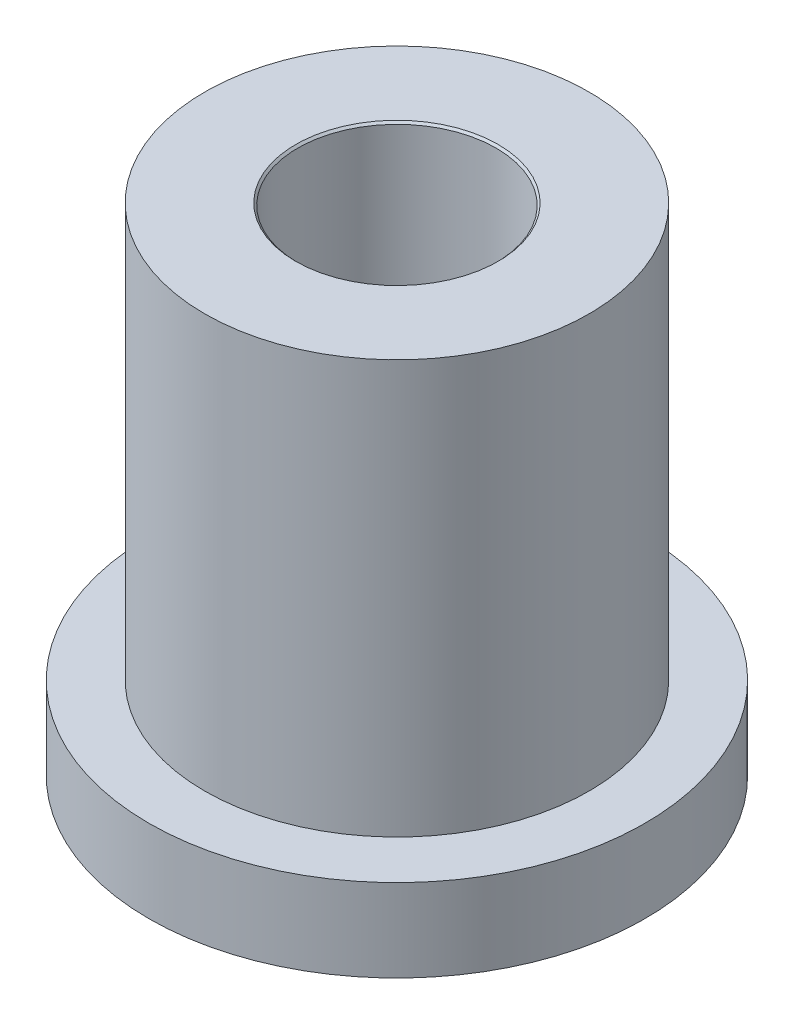
ISO-10303-21;
HEADER;
FILE_DESCRIPTION(('STEP AP214'),'2;1');
FILE_NAME('part.step','',(''),(''),'','','');
FILE_SCHEMA(('AUTOMOTIVE_DESIGN { 1 0 10303 214 1 1 1 1 }'));
ENDSEC;
DATA;
#1=APPLICATION_CONTEXT('core data for automotive mechanical design processes');
#2=APPLICATION_PROTOCOL_DEFINITION('international standard','automotive_design',2000,#1);
#3=PRODUCT_CONTEXT('',#1,'mechanical');
#4=PRODUCT('Part','Part','',(#3));
#5=PRODUCT_RELATED_PRODUCT_CATEGORY('part','',(#4));
#6=PRODUCT_DEFINITION_FORMATION('','',#4);
#7=PRODUCT_DEFINITION_CONTEXT('part definition',#1,'design');
#8=PRODUCT_DEFINITION('design','',#6,#7);
#9=PRODUCT_DEFINITION_SHAPE('','',#8);
#10=(LENGTH_UNIT() NAMED_UNIT(*) SI_UNIT(.MILLI.,.METRE.));
#11=(NAMED_UNIT(*) PLANE_ANGLE_UNIT() SI_UNIT($,.RADIAN.));
#12=(NAMED_UNIT(*) SI_UNIT($,.STERADIAN.) SOLID_ANGLE_UNIT());
#13=UNCERTAINTY_MEASURE_WITH_UNIT(LENGTH_MEASURE(1.E-05),#10,'distance_accuracy_value','');
#14=(GEOMETRIC_REPRESENTATION_CONTEXT(3) GLOBAL_UNCERTAINTY_ASSIGNED_CONTEXT((#13)) GLOBAL_UNIT_ASSIGNED_CONTEXT((#10,
#11,#12)) REPRESENTATION_CONTEXT('',''));
#15=CARTESIAN_POINT('',(0.,0.,0.));
#16=DIRECTION('',(0.,0.,1.));
#17=DIRECTION('',(1.,0.,0.));
#18=AXIS2_PLACEMENT_3D('',#15,#16,#17);
#19=CARTESIAN_POINT('',(0.,1.,0.));
#20=DIRECTION('',(0.,-1.,0.));
#21=DIRECTION('',(0.,0.,-1.));
#22=AXIS2_PLACEMENT_3D('',#19,#20,#21);
#23=CYLINDRICAL_SURFACE('',#22,3.);
#24=CARTESIAN_POINT('',(0.,1.,0.));
#25=DIRECTION('',(0.,1.,0.));
#26=DIRECTION('',(0.,0.,1.));
#27=AXIS2_PLACEMENT_3D('',#24,#25,#26);
#28=CIRCLE('',#27,3.);
#29=CARTESIAN_POINT('',(0.,1.,3.));
#30=VERTEX_POINT('',#29);
#31=EDGE_CURVE('E46',#30,#30,#28,.T.);
#32=ORIENTED_EDGE('',*,*,#31,.F.);
#33=EDGE_LOOP('',(#32));
#34=FACE_BOUND('',#33,.T.);
#35=CARTESIAN_POINT('',(0.,0.,0.));
#36=DIRECTION('',(0.,1.,0.));
#37=DIRECTION('',(0.,0.,1.));
#38=AXIS2_PLACEMENT_3D('',#35,#36,#37);
#39=CIRCLE('',#38,3.);
#40=CARTESIAN_POINT('',(0.,0.,3.));
#41=VERTEX_POINT('',#40);
#42=EDGE_CURVE('E42',#41,#41,#39,.T.);
#43=ORIENTED_EDGE('',*,*,#42,.T.);
#44=EDGE_LOOP('',(#43));
#45=FACE_BOUND('',#44,.T.);
#46=ADVANCED_FACE('F39',(#34,#45),#23,.T.);
#47=CARTESIAN_POINT('',(0.,1.,0.));
#48=DIRECTION('',(0.,1.,0.));
#49=DIRECTION('',(0.,0.,1.));
#50=AXIS2_PLACEMENT_3D('',#47,#48,#49);
#51=PLANE('',#50);
#52=CARTESIAN_POINT('',(0.,1.,0.));
#53=DIRECTION('',(0.,1.,0.));
#54=DIRECTION('',(0.,0.,1.));
#55=AXIS2_PLACEMENT_3D('',#52,#53,#54);
#56=CIRCLE('',#55,2.325);
#57=CARTESIAN_POINT('',(0.,1.,2.325));
#58=VERTEX_POINT('',#57);
#59=EDGE_CURVE('E10',#58,#58,#56,.T.);
#60=ORIENTED_EDGE('',*,*,#59,.F.);
#61=EDGE_LOOP('',(#60));
#62=FACE_BOUND('',#61,.T.);
#63=ORIENTED_EDGE('',*,*,#31,.T.);
#64=EDGE_LOOP('',(#63));
#65=FACE_BOUND('',#64,.T.);
#66=ADVANCED_FACE('F82',(#62,#65),#51,.T.);
#67=CARTESIAN_POINT('',(0.,0.,0.));
#68=DIRECTION('',(0.,1.,0.));
#69=DIRECTION('',(0.,0.,1.));
#70=AXIS2_PLACEMENT_3D('',#67,#68,#69);
#71=PLANE('',#70);
#72=CARTESIAN_POINT('',(0.,0.,0.));
#73=DIRECTION('',(0.,1.,0.));
#74=DIRECTION('',(0.,0.,1.));
#75=AXIS2_PLACEMENT_3D('',#72,#73,#74);
#76=CIRCLE('',#75,1.2);
#77=CARTESIAN_POINT('',(0.,0.,1.2));
#78=VERTEX_POINT('',#77);
#79=EDGE_CURVE('E55',#78,#78,#76,.T.);
#80=ORIENTED_EDGE('',*,*,#79,.T.);
#81=EDGE_LOOP('',(#80));
#82=FACE_BOUND('',#81,.T.);
#83=ORIENTED_EDGE('',*,*,#42,.F.);
#84=EDGE_LOOP('',(#83));
#85=FACE_BOUND('',#84,.T.);
#86=ADVANCED_FACE('F76',(#82,#85),#71,.F.);
#87=CARTESIAN_POINT('',(0.,6.,0.));
#88=DIRECTION('',(0.,-1.,0.));
#89=DIRECTION('',(0.,0.,-1.));
#90=AXIS2_PLACEMENT_3D('',#87,#88,#89);
#91=CYLINDRICAL_SURFACE('',#90,2.325);
#92=CARTESIAN_POINT('',(0.,6.,0.));
#93=DIRECTION('',(0.,1.,0.));
#94=DIRECTION('',(0.,0.,1.));
#95=AXIS2_PLACEMENT_3D('',#92,#93,#94);
#96=CIRCLE('',#95,2.325);
#97=CARTESIAN_POINT('',(0.,6.,2.325));
#98=VERTEX_POINT('',#97);
#99=EDGE_CURVE('E52',#98,#98,#96,.T.);
#100=ORIENTED_EDGE('',*,*,#99,.F.);
#101=EDGE_LOOP('',(#100));
#102=FACE_BOUND('',#101,.T.);
#103=ORIENTED_EDGE('',*,*,#59,.T.);
#104=EDGE_LOOP('',(#103));
#105=FACE_BOUND('',#104,.T.);
#106=ADVANCED_FACE('F71',(#102,#105),#91,.T.);
#107=CARTESIAN_POINT('',(0.,6.,0.));
#108=DIRECTION('',(0.,1.,0.));
#109=DIRECTION('',(0.,0.,1.));
#110=AXIS2_PLACEMENT_3D('',#107,#108,#109);
#111=PLANE('',#110);
#112=CARTESIAN_POINT('',(0.,6.,0.));
#113=DIRECTION('',(0.,1.,0.));
#114=DIRECTION('',(0.,0.,1.));
#115=AXIS2_PLACEMENT_3D('',#112,#113,#114);
#116=CIRCLE('',#115,1.225);
#117=CARTESIAN_POINT('',(0.,6.,1.225));
#118=VERTEX_POINT('',#117);
#119=EDGE_CURVE('E61',#118,#118,#116,.T.);
#120=ORIENTED_EDGE('',*,*,#119,.F.);
#121=EDGE_LOOP('',(#120));
#122=FACE_BOUND('',#121,.T.);
#123=ORIENTED_EDGE('',*,*,#99,.T.);
#124=EDGE_LOOP('',(#123));
#125=FACE_BOUND('',#124,.T.);
#126=ADVANCED_FACE('F67',(#122,#125),#111,.T.);
#127=CARTESIAN_POINT('',(0.,6.,0.));
#128=DIRECTION('',(0.,1.,0.));
#129=DIRECTION('',(0.,0.,1.));
#130=AXIS2_PLACEMENT_3D('',#127,#128,#129);
#131=CYLINDRICAL_SURFACE('',#130,1.2);
#132=ORIENTED_EDGE('',*,*,#79,.F.);
#133=EDGE_LOOP('',(#132));
#134=FACE_BOUND('',#133,.T.);
#135=CARTESIAN_POINT('',(0.,5.975,0.));
#136=DIRECTION('',(0.,1.,0.));
#137=DIRECTION('',(0.,0.,1.));
#138=AXIS2_PLACEMENT_3D('',#135,#136,#137);
#139=CIRCLE('',#138,1.2);
#140=CARTESIAN_POINT('',(0.,5.975,1.2));
#141=VERTEX_POINT('',#140);
#142=EDGE_CURVE('E58',#141,#141,#139,.T.);
#143=ORIENTED_EDGE('',*,*,#142,.T.);
#144=EDGE_LOOP('',(#143));
#145=FACE_BOUND('',#144,.T.);
#146=ADVANCED_FACE('F70',(#134,#145),#131,.F.);
#147=CARTESIAN_POINT('',(0.,6.,0.));
#148=DIRECTION('',(0.,1.,0.));
#149=DIRECTION('',(0.,0.,1.));
#150=AXIS2_PLACEMENT_3D('',#147,#148,#149);
#151=CONICAL_SURFACE('',#150,1.225,0.785398163397457);
#152=ORIENTED_EDGE('',*,*,#142,.F.);
#153=EDGE_LOOP('',(#152));
#154=FACE_BOUND('',#153,.T.);
#155=ORIENTED_EDGE('',*,*,#119,.T.);
#156=EDGE_LOOP('',(#155));
#157=FACE_BOUND('',#156,.T.);
#158=ADVANCED_FACE('F65',(#154,#157),#151,.F.);
#159=CLOSED_SHELL('',(#46,#66,#86,#106,#126,#146,#158));
#160=MANIFOLD_SOLID_BREP('B2',#159);
#161=ADVANCED_BREP_SHAPE_REPRESENTATION('',(#18,#160),#14);
#162=SHAPE_DEFINITION_REPRESENTATION(#9,#161);
ENDSEC;
END-ISO-10303-21;
